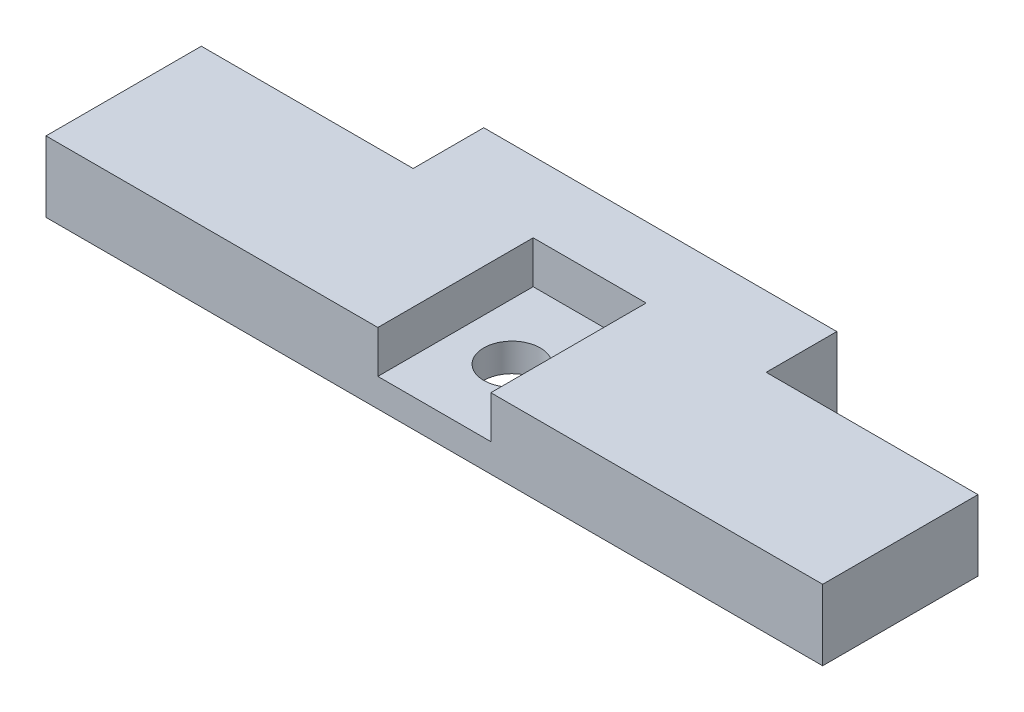
ISO-10303-21;
HEADER;
FILE_DESCRIPTION(('STEP AP214'),'2;1');
FILE_NAME('part.step','',(''),(''),'','','');
FILE_SCHEMA(('AUTOMOTIVE_DESIGN { 1 0 10303 214 1 1 1 1 }'));
ENDSEC;
DATA;
#1=APPLICATION_CONTEXT('core data for automotive mechanical design processes');
#2=APPLICATION_PROTOCOL_DEFINITION('international standard','automotive_design',2000,#1);
#3=PRODUCT_CONTEXT('',#1,'mechanical');
#4=PRODUCT('Part','Part','',(#3));
#5=PRODUCT_RELATED_PRODUCT_CATEGORY('part','',(#4));
#6=PRODUCT_DEFINITION_FORMATION('','',#4);
#7=PRODUCT_DEFINITION_CONTEXT('part definition',#1,'design');
#8=PRODUCT_DEFINITION('design','',#6,#7);
#9=PRODUCT_DEFINITION_SHAPE('','',#8);
#10=(LENGTH_UNIT() NAMED_UNIT(*) SI_UNIT(.MILLI.,.METRE.));
#11=(NAMED_UNIT(*) PLANE_ANGLE_UNIT() SI_UNIT($,.RADIAN.));
#12=(NAMED_UNIT(*) SI_UNIT($,.STERADIAN.) SOLID_ANGLE_UNIT());
#13=UNCERTAINTY_MEASURE_WITH_UNIT(LENGTH_MEASURE(1.E-05),#10,'distance_accuracy_value','');
#14=(GEOMETRIC_REPRESENTATION_CONTEXT(3) GLOBAL_UNCERTAINTY_ASSIGNED_CONTEXT((#13)) GLOBAL_UNIT_ASSIGNED_CONTEXT((#10,
#11,#12)) REPRESENTATION_CONTEXT('',''));
#15=CARTESIAN_POINT('',(0.,0.,0.));
#16=DIRECTION('',(0.,0.,1.));
#17=DIRECTION('',(1.,0.,0.));
#18=AXIS2_PLACEMENT_3D('',#15,#16,#17);
#19=CARTESIAN_POINT('',(27.5,5.,-3.));
#20=DIRECTION('',(-1.,0.,0.));
#21=DIRECTION('',(0.,0.,1.));
#22=AXIS2_PLACEMENT_3D('',#19,#20,#21);
#23=PLANE('',#22);
#24=DIRECTION('',(0.,0.,-1.));
#25=VECTOR('',#24,1.);
#26=CARTESIAN_POINT('',(27.5,0.,-3.));
#27=LINE('',#26,#25);
#28=CARTESIAN_POINT('',(27.5,0.,8.));
#29=VERTEX_POINT('',#28);
#30=CARTESIAN_POINT('',(27.5,0.,-3.));
#31=VERTEX_POINT('',#30);
#32=EDGE_CURVE('E145',#29,#31,#27,.T.);
#33=ORIENTED_EDGE('',*,*,#32,.T.);
#34=DIRECTION('',(0.,-1.,0.));
#35=VECTOR('',#34,1.);
#36=CARTESIAN_POINT('',(27.5,5.,-3.));
#37=LINE('',#36,#35);
#38=CARTESIAN_POINT('',(27.5,5.,-3.));
#39=VERTEX_POINT('',#38);
#40=EDGE_CURVE('E11',#39,#31,#37,.T.);
#41=ORIENTED_EDGE('',*,*,#40,.F.);
#42=DIRECTION('',(0.,0.,-1.));
#43=VECTOR('',#42,1.);
#44=CARTESIAN_POINT('',(27.5,5.,-3.));
#45=LINE('',#44,#43);
#46=CARTESIAN_POINT('',(27.5,5.,8.));
#47=VERTEX_POINT('',#46);
#48=EDGE_CURVE('E161',#47,#39,#45,.T.);
#49=ORIENTED_EDGE('',*,*,#48,.F.);
#50=DIRECTION('',(0.,-1.,0.));
#51=VECTOR('',#50,1.);
#52=CARTESIAN_POINT('',(27.5,5.,8.));
#53=LINE('',#52,#51);
#54=EDGE_CURVE('E144',#47,#29,#53,.T.);
#55=ORIENTED_EDGE('',*,*,#54,.T.);
#56=EDGE_LOOP('',(#33,#41,#49,#55));
#57=FACE_BOUND('',#56,.T.);
#58=ADVANCED_FACE('F33',(#57),#23,.F.);
#59=CARTESIAN_POINT('',(12.5,5.,-3.));
#60=DIRECTION('',(0.,0.,1.));
#61=DIRECTION('',(1.,0.,0.));
#62=AXIS2_PLACEMENT_3D('',#59,#60,#61);
#63=PLANE('',#62);
#64=DIRECTION('',(-1.,0.,0.));
#65=VECTOR('',#64,1.);
#66=CARTESIAN_POINT('',(12.5,0.,-3.));
#67=LINE('',#66,#65);
#68=CARTESIAN_POINT('',(12.5,0.,-3.));
#69=VERTEX_POINT('',#68);
#70=EDGE_CURVE('E148',#31,#69,#67,.T.);
#71=ORIENTED_EDGE('',*,*,#70,.T.);
#72=DIRECTION('',(0.,-1.,0.));
#73=VECTOR('',#72,1.);
#74=CARTESIAN_POINT('',(12.5,5.,-3.));
#75=LINE('',#74,#73);
#76=CARTESIAN_POINT('',(12.5,5.,-3.));
#77=VERTEX_POINT('',#76);
#78=EDGE_CURVE('E40',#77,#69,#75,.T.);
#79=ORIENTED_EDGE('',*,*,#78,.F.);
#80=DIRECTION('',(-1.,0.,0.));
#81=VECTOR('',#80,1.);
#82=CARTESIAN_POINT('',(12.5,5.,-3.));
#83=LINE('',#82,#81);
#84=EDGE_CURVE('E97',#39,#77,#83,.T.);
#85=ORIENTED_EDGE('',*,*,#84,.F.);
#86=ORIENTED_EDGE('',*,*,#40,.T.);
#87=EDGE_LOOP('',(#71,#79,#85,#86));
#88=FACE_BOUND('',#87,.T.);
#89=ADVANCED_FACE('F251',(#88),#63,.F.);
#90=CARTESIAN_POINT('',(12.5,5.,-8.));
#91=DIRECTION('',(-1.,0.,0.));
#92=DIRECTION('',(0.,0.,1.));
#93=AXIS2_PLACEMENT_3D('',#90,#91,#92);
#94=PLANE('',#93);
#95=DIRECTION('',(0.,0.,-1.));
#96=VECTOR('',#95,1.);
#97=CARTESIAN_POINT('',(12.5,0.,-8.));
#98=LINE('',#97,#96);
#99=CARTESIAN_POINT('',(12.5,0.,-8.));
#100=VERTEX_POINT('',#99);
#101=EDGE_CURVE('E151',#69,#100,#98,.T.);
#102=ORIENTED_EDGE('',*,*,#101,.T.);
#103=DIRECTION('',(0.,-1.,0.));
#104=VECTOR('',#103,1.);
#105=CARTESIAN_POINT('',(12.5,5.,-8.));
#106=LINE('',#105,#104);
#107=CARTESIAN_POINT('',(12.5,5.,-8.));
#108=VERTEX_POINT('',#107);
#109=EDGE_CURVE('E168',#108,#100,#106,.T.);
#110=ORIENTED_EDGE('',*,*,#109,.F.);
#111=DIRECTION('',(0.,0.,-1.));
#112=VECTOR('',#111,1.);
#113=CARTESIAN_POINT('',(12.5,5.,-8.));
#114=LINE('',#113,#112);
#115=EDGE_CURVE('E176',#77,#108,#114,.T.);
#116=ORIENTED_EDGE('',*,*,#115,.F.);
#117=ORIENTED_EDGE('',*,*,#78,.T.);
#118=EDGE_LOOP('',(#102,#110,#116,#117));
#119=FACE_BOUND('',#118,.T.);
#120=ADVANCED_FACE('F174',(#119),#94,.F.);
#121=CARTESIAN_POINT('',(-12.5,5.,-8.));
#122=DIRECTION('',(0.,0.,1.));
#123=DIRECTION('',(1.,0.,0.));
#124=AXIS2_PLACEMENT_3D('',#121,#122,#123);
#125=PLANE('',#124);
#126=DIRECTION('',(-1.,0.,0.));
#127=VECTOR('',#126,1.);
#128=CARTESIAN_POINT('',(-12.5,0.,-8.));
#129=LINE('',#128,#127);
#130=CARTESIAN_POINT('',(-12.5,0.,-8.));
#131=VERTEX_POINT('',#130);
#132=EDGE_CURVE('E153',#100,#131,#129,.T.);
#133=ORIENTED_EDGE('',*,*,#132,.T.);
#134=DIRECTION('',(0.,-1.,0.));
#135=VECTOR('',#134,1.);
#136=CARTESIAN_POINT('',(-12.5,5.,-8.));
#137=LINE('',#136,#135);
#138=CARTESIAN_POINT('',(-12.5,5.,-8.));
#139=VERTEX_POINT('',#138);
#140=EDGE_CURVE('E165',#139,#131,#137,.T.);
#141=ORIENTED_EDGE('',*,*,#140,.F.);
#142=DIRECTION('',(-1.,0.,0.));
#143=VECTOR('',#142,1.);
#144=CARTESIAN_POINT('',(-12.5,5.,-8.));
#145=LINE('',#144,#143);
#146=EDGE_CURVE('E188',#108,#139,#145,.T.);
#147=ORIENTED_EDGE('',*,*,#146,.F.);
#148=ORIENTED_EDGE('',*,*,#109,.T.);
#149=EDGE_LOOP('',(#133,#141,#147,#148));
#150=FACE_BOUND('',#149,.T.);
#151=ADVANCED_FACE('F184',(#150),#125,.F.);
#152=CARTESIAN_POINT('',(-12.5,5.,-8.));
#153=DIRECTION('',(1.,0.,0.));
#154=DIRECTION('',(0.,0.,-1.));
#155=AXIS2_PLACEMENT_3D('',#152,#153,#154);
#156=PLANE('',#155);
#157=DIRECTION('',(0.,0.,1.));
#158=VECTOR('',#157,1.);
#159=CARTESIAN_POINT('',(-12.5,0.,-8.));
#160=LINE('',#159,#158);
#161=CARTESIAN_POINT('',(-12.5,0.,-3.));
#162=VERTEX_POINT('',#161);
#163=EDGE_CURVE('E155',#131,#162,#160,.T.);
#164=ORIENTED_EDGE('',*,*,#163,.T.);
#165=DIRECTION('',(0.,-1.,0.));
#166=VECTOR('',#165,1.);
#167=CARTESIAN_POINT('',(-12.5,5.,-3.));
#168=LINE('',#167,#166);
#169=CARTESIAN_POINT('',(-12.5,5.,-3.));
#170=VERTEX_POINT('',#169);
#171=EDGE_CURVE('E134',#170,#162,#168,.T.);
#172=ORIENTED_EDGE('',*,*,#171,.F.);
#173=DIRECTION('',(0.,0.,1.));
#174=VECTOR('',#173,1.);
#175=CARTESIAN_POINT('',(-12.5,5.,-8.));
#176=LINE('',#175,#174);
#177=EDGE_CURVE('E122',#139,#170,#176,.T.);
#178=ORIENTED_EDGE('',*,*,#177,.F.);
#179=ORIENTED_EDGE('',*,*,#140,.T.);
#180=EDGE_LOOP('',(#164,#172,#178,#179));
#181=FACE_BOUND('',#180,.T.);
#182=ADVANCED_FACE('F187',(#181),#156,.F.);
#183=CARTESIAN_POINT('',(-12.5,5.,-3.));
#184=DIRECTION('',(0.,0.,1.));
#185=DIRECTION('',(1.,0.,0.));
#186=AXIS2_PLACEMENT_3D('',#183,#184,#185);
#187=PLANE('',#186);
#188=DIRECTION('',(-1.,0.,0.));
#189=VECTOR('',#188,1.);
#190=CARTESIAN_POINT('',(-12.5,0.,-3.));
#191=LINE('',#190,#189);
#192=CARTESIAN_POINT('',(-27.5,0.,-3.));
#193=VERTEX_POINT('',#192);
#194=EDGE_CURVE('E131',#162,#193,#191,.T.);
#195=ORIENTED_EDGE('',*,*,#194,.T.);
#196=DIRECTION('',(0.,-1.,0.));
#197=VECTOR('',#196,1.);
#198=CARTESIAN_POINT('',(-27.5,5.,-3.));
#199=LINE('',#198,#197);
#200=CARTESIAN_POINT('',(-27.5,5.,-3.));
#201=VERTEX_POINT('',#200);
#202=EDGE_CURVE('E128',#201,#193,#199,.T.);
#203=ORIENTED_EDGE('',*,*,#202,.F.);
#204=DIRECTION('',(-1.,0.,0.));
#205=VECTOR('',#204,1.);
#206=CARTESIAN_POINT('',(-12.5,5.,-3.));
#207=LINE('',#206,#205);
#208=EDGE_CURVE('E113',#170,#201,#207,.T.);
#209=ORIENTED_EDGE('',*,*,#208,.F.);
#210=ORIENTED_EDGE('',*,*,#171,.T.);
#211=EDGE_LOOP('',(#195,#203,#209,#210));
#212=FACE_BOUND('',#211,.T.);
#213=ADVANCED_FACE('F129',(#212),#187,.F.);
#214=CARTESIAN_POINT('',(-27.5,5.,-3.));
#215=DIRECTION('',(1.,0.,0.));
#216=DIRECTION('',(0.,0.,-1.));
#217=AXIS2_PLACEMENT_3D('',#214,#215,#216);
#218=PLANE('',#217);
#219=DIRECTION('',(0.,0.,1.));
#220=VECTOR('',#219,1.);
#221=CARTESIAN_POINT('',(-27.5,0.,-3.));
#222=LINE('',#221,#220);
#223=CARTESIAN_POINT('',(-27.5,0.,8.));
#224=VERTEX_POINT('',#223);
#225=EDGE_CURVE('E158',#193,#224,#222,.T.);
#226=ORIENTED_EDGE('',*,*,#225,.T.);
#227=DIRECTION('',(0.,-1.,0.));
#228=VECTOR('',#227,1.);
#229=CARTESIAN_POINT('',(-27.5,5.,8.));
#230=LINE('',#229,#228);
#231=CARTESIAN_POINT('',(-27.5,5.,8.));
#232=VERTEX_POINT('',#231);
#233=EDGE_CURVE('E135',#232,#224,#230,.T.);
#234=ORIENTED_EDGE('',*,*,#233,.F.);
#235=DIRECTION('',(0.,0.,1.));
#236=VECTOR('',#235,1.);
#237=CARTESIAN_POINT('',(-27.5,5.,-3.));
#238=LINE('',#237,#236);
#239=EDGE_CURVE('E119',#201,#232,#238,.T.);
#240=ORIENTED_EDGE('',*,*,#239,.F.);
#241=ORIENTED_EDGE('',*,*,#202,.T.);
#242=EDGE_LOOP('',(#226,#234,#240,#241));
#243=FACE_BOUND('',#242,.T.);
#244=ADVANCED_FACE('F137',(#243),#218,.F.);
#245=CARTESIAN_POINT('',(-27.5,5.,8.));
#246=DIRECTION('',(0.,0.,-1.));
#247=DIRECTION('',(-1.,0.,0.));
#248=AXIS2_PLACEMENT_3D('',#245,#246,#247);
#249=PLANE('',#248);
#250=DIRECTION('',(1.,0.,0.));
#251=VECTOR('',#250,1.);
#252=CARTESIAN_POINT('',(4.,2.,8.));
#253=LINE('',#252,#251);
#254=CARTESIAN_POINT('',(-3.99999999999999,2.,8.));
#255=VERTEX_POINT('',#254);
#256=CARTESIAN_POINT('',(4.,2.,8.));
#257=VERTEX_POINT('',#256);
#258=EDGE_CURVE('E207',#255,#257,#253,.T.);
#259=ORIENTED_EDGE('',*,*,#258,.F.);
#260=DIRECTION('',(0.,1.,0.));
#261=VECTOR('',#260,1.);
#262=CARTESIAN_POINT('',(-3.99999999999999,2.,8.));
#263=LINE('',#262,#261);
#264=CARTESIAN_POINT('',(-3.99999999999999,5.,8.));
#265=VERTEX_POINT('',#264);
#266=EDGE_CURVE('E149',#255,#265,#263,.T.);
#267=ORIENTED_EDGE('',*,*,#266,.T.);
#268=DIRECTION('',(1.,0.,0.));
#269=VECTOR('',#268,1.);
#270=CARTESIAN_POINT('',(-27.5,5.,8.));
#271=LINE('',#270,#269);
#272=EDGE_CURVE('E140',#232,#265,#271,.T.);
#273=ORIENTED_EDGE('',*,*,#272,.F.);
#274=ORIENTED_EDGE('',*,*,#233,.T.);
#275=DIRECTION('',(1.,0.,0.));
#276=VECTOR('',#275,1.);
#277=CARTESIAN_POINT('',(-27.5,0.,8.));
#278=LINE('',#277,#276);
#279=EDGE_CURVE('E89',#224,#29,#278,.T.);
#280=ORIENTED_EDGE('',*,*,#279,.T.);
#281=ORIENTED_EDGE('',*,*,#54,.F.);
#282=CARTESIAN_POINT('',(4.,5.,8.));
#283=VERTEX_POINT('',#282);
#284=EDGE_CURVE('E55',#283,#47,#271,.T.);
#285=ORIENTED_EDGE('',*,*,#284,.F.);
#286=DIRECTION('',(0.,1.,0.));
#287=VECTOR('',#286,1.);
#288=CARTESIAN_POINT('',(4.,2.,8.));
#289=LINE('',#288,#287);
#290=EDGE_CURVE('E47',#257,#283,#289,.T.);
#291=ORIENTED_EDGE('',*,*,#290,.F.);
#292=EDGE_LOOP('',(#259,#267,#273,#274,#280,#281,#285,#291));
#293=FACE_BOUND('',#292,.T.);
#294=ADVANCED_FACE('F247',(#293),#249,.F.);
#295=CARTESIAN_POINT('',(0.,5.,0.));
#296=DIRECTION('',(0.,1.,0.));
#297=DIRECTION('',(0.,0.,1.));
#298=AXIS2_PLACEMENT_3D('',#295,#296,#297);
#299=PLANE('',#298);
#300=DIRECTION('',(0.,0.,1.));
#301=VECTOR('',#300,1.);
#302=CARTESIAN_POINT('',(-3.99999999999999,5.,8.));
#303=LINE('',#302,#301);
#304=CARTESIAN_POINT('',(-4.,5.,-3.));
#305=VERTEX_POINT('',#304);
#306=EDGE_CURVE('E204',#305,#265,#303,.T.);
#307=ORIENTED_EDGE('',*,*,#306,.F.);
#308=DIRECTION('',(-1.,0.,0.));
#309=VECTOR('',#308,1.);
#310=CARTESIAN_POINT('',(4.,5.,-3.));
#311=LINE('',#310,#309);
#312=CARTESIAN_POINT('',(4.,5.,-3.));
#313=VERTEX_POINT('',#312);
#314=EDGE_CURVE('E208',#313,#305,#311,.T.);
#315=ORIENTED_EDGE('',*,*,#314,.F.);
#316=DIRECTION('',(0.,0.,-1.));
#317=VECTOR('',#316,1.);
#318=CARTESIAN_POINT('',(4.,5.,8.));
#319=LINE('',#318,#317);
#320=EDGE_CURVE('E211',#283,#313,#319,.T.);
#321=ORIENTED_EDGE('',*,*,#320,.F.);
#322=ORIENTED_EDGE('',*,*,#284,.T.);
#323=ORIENTED_EDGE('',*,*,#48,.T.);
#324=ORIENTED_EDGE('',*,*,#84,.T.);
#325=ORIENTED_EDGE('',*,*,#115,.T.);
#326=ORIENTED_EDGE('',*,*,#146,.T.);
#327=ORIENTED_EDGE('',*,*,#177,.T.);
#328=ORIENTED_EDGE('',*,*,#208,.T.);
#329=ORIENTED_EDGE('',*,*,#239,.T.);
#330=ORIENTED_EDGE('',*,*,#272,.T.);
#331=EDGE_LOOP('',(#307,#315,#321,#322,#323,#324,#325,#326,#327,#328,#329,#330));
#332=FACE_BOUND('',#331,.T.);
#333=ADVANCED_FACE('F116',(#332),#299,.T.);
#334=CARTESIAN_POINT('',(0.,0.,0.));
#335=DIRECTION('',(0.,1.,0.));
#336=DIRECTION('',(0.,0.,1.));
#337=AXIS2_PLACEMENT_3D('',#334,#335,#336);
#338=PLANE('',#337);
#339=CARTESIAN_POINT('',(0.,0.,2.5));
#340=DIRECTION('',(0.,1.,0.));
#341=DIRECTION('',(0.,0.,1.));
#342=AXIS2_PLACEMENT_3D('',#339,#340,#341);
#343=CIRCLE('',#342,2.);
#344=CARTESIAN_POINT('',(0.,0.,4.5));
#345=VERTEX_POINT('',#344);
#346=EDGE_CURVE('E213',#345,#345,#343,.T.);
#347=ORIENTED_EDGE('',*,*,#346,.T.);
#348=EDGE_LOOP('',(#347));
#349=FACE_BOUND('',#348,.T.);
#350=ORIENTED_EDGE('',*,*,#32,.F.);
#351=ORIENTED_EDGE('',*,*,#279,.F.);
#352=ORIENTED_EDGE('',*,*,#225,.F.);
#353=ORIENTED_EDGE('',*,*,#194,.F.);
#354=ORIENTED_EDGE('',*,*,#163,.F.);
#355=ORIENTED_EDGE('',*,*,#132,.F.);
#356=ORIENTED_EDGE('',*,*,#101,.F.);
#357=ORIENTED_EDGE('',*,*,#70,.F.);
#358=EDGE_LOOP('',(#350,#351,#352,#353,#354,#355,#356,#357));
#359=FACE_BOUND('',#358,.T.);
#360=ADVANCED_FACE('F180',(#349,#359),#338,.F.);
#361=CARTESIAN_POINT('',(-3.99999999999999,2.,8.));
#362=DIRECTION('',(-1.,0.,0.));
#363=DIRECTION('',(0.,0.,1.));
#364=AXIS2_PLACEMENT_3D('',#361,#362,#363);
#365=PLANE('',#364);
#366=ORIENTED_EDGE('',*,*,#306,.T.);
#367=ORIENTED_EDGE('',*,*,#266,.F.);
#368=DIRECTION('',(0.,0.,1.));
#369=VECTOR('',#368,1.);
#370=CARTESIAN_POINT('',(-3.99999999999999,2.,8.));
#371=LINE('',#370,#369);
#372=CARTESIAN_POINT('',(-4.,2.,-3.));
#373=VERTEX_POINT('',#372);
#374=EDGE_CURVE('E196',#373,#255,#371,.T.);
#375=ORIENTED_EDGE('',*,*,#374,.F.);
#376=DIRECTION('',(0.,1.,0.));
#377=VECTOR('',#376,1.);
#378=CARTESIAN_POINT('',(-4.,2.,-3.));
#379=LINE('',#378,#377);
#380=EDGE_CURVE('E199',#373,#305,#379,.T.);
#381=ORIENTED_EDGE('',*,*,#380,.T.);
#382=EDGE_LOOP('',(#366,#367,#375,#381));
#383=FACE_BOUND('',#382,.T.);
#384=ADVANCED_FACE('F271',(#383),#365,.F.);
#385=CARTESIAN_POINT('',(4.,2.,-3.));
#386=DIRECTION('',(0.,0.,-1.));
#387=DIRECTION('',(-1.,0.,0.));
#388=AXIS2_PLACEMENT_3D('',#385,#386,#387);
#389=PLANE('',#388);
#390=ORIENTED_EDGE('',*,*,#314,.T.);
#391=ORIENTED_EDGE('',*,*,#380,.F.);
#392=DIRECTION('',(-1.,0.,0.));
#393=VECTOR('',#392,1.);
#394=CARTESIAN_POINT('',(4.,2.,-3.));
#395=LINE('',#394,#393);
#396=CARTESIAN_POINT('',(4.,2.,-3.));
#397=VERTEX_POINT('',#396);
#398=EDGE_CURVE('E216',#397,#373,#395,.T.);
#399=ORIENTED_EDGE('',*,*,#398,.F.);
#400=DIRECTION('',(0.,1.,0.));
#401=VECTOR('',#400,1.);
#402=CARTESIAN_POINT('',(4.,2.,-3.));
#403=LINE('',#402,#401);
#404=EDGE_CURVE('E195',#397,#313,#403,.T.);
#405=ORIENTED_EDGE('',*,*,#404,.T.);
#406=EDGE_LOOP('',(#390,#391,#399,#405));
#407=FACE_BOUND('',#406,.T.);
#408=ADVANCED_FACE('F276',(#407),#389,.F.);
#409=CARTESIAN_POINT('',(4.,2.,8.));
#410=DIRECTION('',(1.,0.,0.));
#411=DIRECTION('',(0.,0.,-1.));
#412=AXIS2_PLACEMENT_3D('',#409,#410,#411);
#413=PLANE('',#412);
#414=ORIENTED_EDGE('',*,*,#320,.T.);
#415=ORIENTED_EDGE('',*,*,#404,.F.);
#416=DIRECTION('',(0.,0.,-1.));
#417=VECTOR('',#416,1.);
#418=CARTESIAN_POINT('',(4.,2.,8.));
#419=LINE('',#418,#417);
#420=EDGE_CURVE('E219',#257,#397,#419,.T.);
#421=ORIENTED_EDGE('',*,*,#420,.F.);
#422=ORIENTED_EDGE('',*,*,#290,.T.);
#423=EDGE_LOOP('',(#414,#415,#421,#422));
#424=FACE_BOUND('',#423,.T.);
#425=ADVANCED_FACE('F240',(#424),#413,.F.);
#426=CARTESIAN_POINT('',(0.,2.,0.));
#427=DIRECTION('',(0.,-1.,0.));
#428=DIRECTION('',(0.,0.,-1.));
#429=AXIS2_PLACEMENT_3D('',#426,#427,#428);
#430=PLANE('',#429);
#431=CARTESIAN_POINT('',(0.,2.,2.5));
#432=DIRECTION('',(0.,1.,0.));
#433=DIRECTION('',(0.,0.,1.));
#434=AXIS2_PLACEMENT_3D('',#431,#432,#433);
#435=CIRCLE('',#434,2.);
#436=CARTESIAN_POINT('',(0.,2.,4.5));
#437=VERTEX_POINT('',#436);
#438=EDGE_CURVE('E224',#437,#437,#435,.T.);
#439=ORIENTED_EDGE('',*,*,#438,.F.);
#440=EDGE_LOOP('',(#439));
#441=FACE_BOUND('',#440,.T.);
#442=ORIENTED_EDGE('',*,*,#258,.T.);
#443=ORIENTED_EDGE('',*,*,#420,.T.);
#444=ORIENTED_EDGE('',*,*,#398,.T.);
#445=ORIENTED_EDGE('',*,*,#374,.T.);
#446=EDGE_LOOP('',(#442,#443,#444,#445));
#447=FACE_BOUND('',#446,.T.);
#448=ADVANCED_FACE('F234',(#441,#447),#430,.F.);
#449=CARTESIAN_POINT('',(0.,0.,2.5));
#450=DIRECTION('',(0.,1.,0.));
#451=DIRECTION('',(0.,0.,1.));
#452=AXIS2_PLACEMENT_3D('',#449,#450,#451);
#453=CYLINDRICAL_SURFACE('',#452,2.);
#454=ORIENTED_EDGE('',*,*,#346,.F.);
#455=EDGE_LOOP('',(#454));
#456=FACE_BOUND('',#455,.T.);
#457=ORIENTED_EDGE('',*,*,#438,.T.);
#458=EDGE_LOOP('',(#457));
#459=FACE_BOUND('',#458,.T.);
#460=ADVANCED_FACE('F231',(#456,#459),#453,.F.);
#461=CLOSED_SHELL('',(#58,#89,#120,#151,#182,#213,#244,#294,#333,#360,#384,#408,#425,#448,#460));
#462=MANIFOLD_SOLID_BREP('B2',#461);
#463=ADVANCED_BREP_SHAPE_REPRESENTATION('',(#18,#462),#14);
#464=SHAPE_DEFINITION_REPRESENTATION(#9,#463);
ENDSEC;
END-ISO-10303-21;
